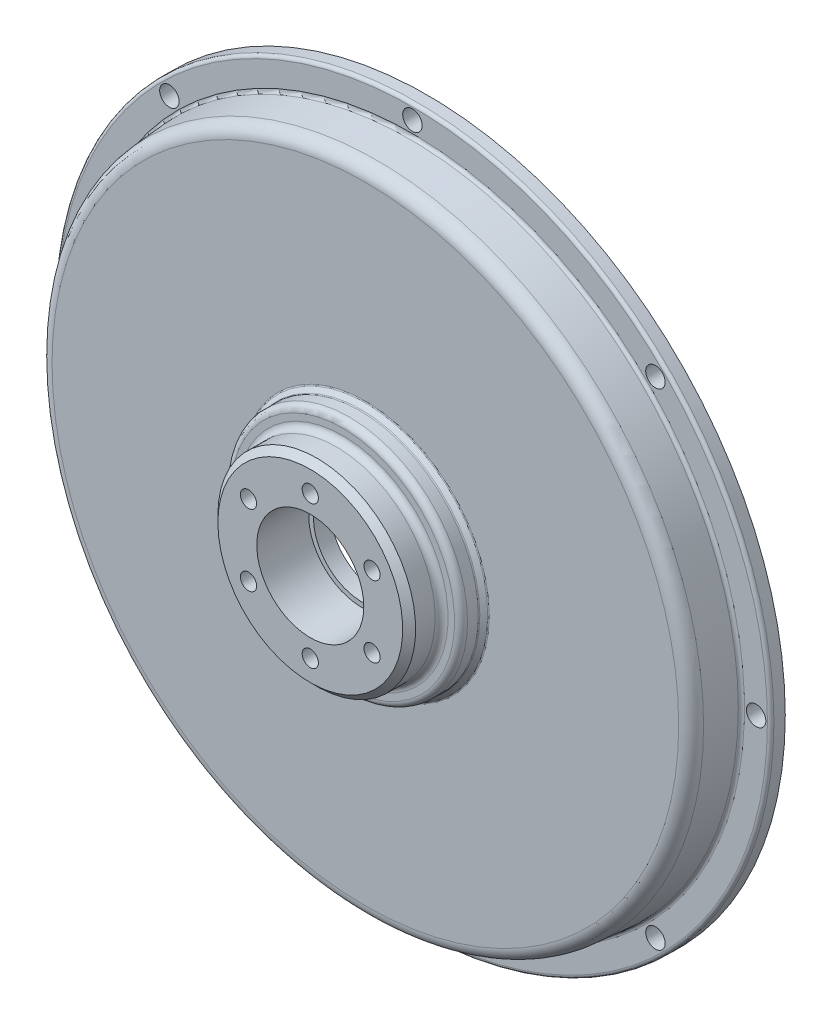
ISO-10303-21;
HEADER;
FILE_DESCRIPTION(('STEP AP214'),'2;1');
FILE_NAME('part.step','',(''),(''),'','','');
FILE_SCHEMA(('AUTOMOTIVE_DESIGN { 1 0 10303 214 1 1 1 1 }'));
ENDSEC;
DATA;
#1=APPLICATION_CONTEXT('core data for automotive mechanical design processes');
#2=APPLICATION_PROTOCOL_DEFINITION('international standard','automotive_design',2000,#1);
#3=PRODUCT_CONTEXT('',#1,'mechanical');
#4=PRODUCT('Part','Part','',(#3));
#5=PRODUCT_RELATED_PRODUCT_CATEGORY('part','',(#4));
#6=PRODUCT_DEFINITION_FORMATION('','',#4);
#7=PRODUCT_DEFINITION_CONTEXT('part definition',#1,'design');
#8=PRODUCT_DEFINITION('design','',#6,#7);
#9=PRODUCT_DEFINITION_SHAPE('','',#8);
#10=(LENGTH_UNIT() NAMED_UNIT(*) SI_UNIT(.MILLI.,.METRE.));
#11=(NAMED_UNIT(*) PLANE_ANGLE_UNIT() SI_UNIT($,.RADIAN.));
#12=(NAMED_UNIT(*) SI_UNIT($,.STERADIAN.) SOLID_ANGLE_UNIT());
#13=UNCERTAINTY_MEASURE_WITH_UNIT(LENGTH_MEASURE(1.E-05),#10,'distance_accuracy_value','');
#14=(GEOMETRIC_REPRESENTATION_CONTEXT(3) GLOBAL_UNCERTAINTY_ASSIGNED_CONTEXT((#13)) GLOBAL_UNIT_ASSIGNED_CONTEXT((#10,
#11,#12)) REPRESENTATION_CONTEXT('',''));
#15=CARTESIAN_POINT('',(0.,0.,0.));
#16=DIRECTION('',(0.,0.,1.));
#17=DIRECTION('',(1.,0.,0.));
#18=AXIS2_PLACEMENT_3D('',#15,#16,#17);
#19=CARTESIAN_POINT('',(-28.5,0.,36.));
#20=DIRECTION('',(0.,0.,1.));
#21=DIRECTION('',(1.,0.,0.));
#22=AXIS2_PLACEMENT_3D('',#19,#20,#21);
#23=PLANE('',#22);
#24=CARTESIAN_POINT('',(0.,22.,36.));
#25=DIRECTION('',(0.,0.,1.));
#26=DIRECTION('',(1.,0.,0.));
#27=AXIS2_PLACEMENT_3D('',#24,#25,#26);
#28=CIRCLE('',#27,2.5);
#29=CARTESIAN_POINT('',(2.5,22.,36.));
#30=VERTEX_POINT('',#29);
#31=EDGE_CURVE('E323',#30,#30,#28,.T.);
#32=ORIENTED_EDGE('',*,*,#31,.F.);
#33=EDGE_LOOP('',(#32));
#34=FACE_BOUND('',#33,.T.);
#35=CARTESIAN_POINT('',(-19.0525588832573,10.9999999999995,36.));
#36=DIRECTION('',(0.,0.,1.));
#37=DIRECTION('',(1.,0.,0.));
#38=AXIS2_PLACEMENT_3D('',#35,#36,#37);
#39=CIRCLE('',#38,2.50000000000071);
#40=CARTESIAN_POINT('',(-16.5525588832566,10.9999999999995,36.));
#41=VERTEX_POINT('',#40);
#42=EDGE_CURVE('E316',#41,#41,#39,.T.);
#43=ORIENTED_EDGE('',*,*,#42,.F.);
#44=EDGE_LOOP('',(#43));
#45=FACE_BOUND('',#44,.T.);
#46=CARTESIAN_POINT('',(-19.0525588832567,-11.0000000000005,36.));
#47=DIRECTION('',(0.,0.,1.));
#48=DIRECTION('',(1.,0.,0.));
#49=AXIS2_PLACEMENT_3D('',#46,#47,#48);
#50=CIRCLE('',#49,2.50000000000123);
#51=CARTESIAN_POINT('',(-16.5525588832555,-11.0000000000005,36.));
#52=VERTEX_POINT('',#51);
#53=EDGE_CURVE('E330',#52,#52,#50,.T.);
#54=ORIENTED_EDGE('',*,*,#53,.F.);
#55=EDGE_LOOP('',(#54));
#56=FACE_BOUND('',#55,.T.);
#57=CARTESIAN_POINT('',(1.23822787511762E-12,-22.,36.));
#58=DIRECTION('',(0.,0.,1.));
#59=DIRECTION('',(1.,0.,0.));
#60=AXIS2_PLACEMENT_3D('',#57,#58,#59);
#61=CIRCLE('',#60,2.50000000000132);
#62=CARTESIAN_POINT('',(2.50000000000256,-22.,36.));
#63=VERTEX_POINT('',#62);
#64=EDGE_CURVE('E347',#63,#63,#61,.T.);
#65=ORIENTED_EDGE('',*,*,#64,.F.);
#66=EDGE_LOOP('',(#65));
#67=FACE_BOUND('',#66,.T.);
#68=CARTESIAN_POINT('',(19.0525588832586,-10.9999999999995,36.));
#69=DIRECTION('',(0.,0.,1.));
#70=DIRECTION('',(1.,0.,0.));
#71=AXIS2_PLACEMENT_3D('',#68,#69,#70);
#72=CIRCLE('',#71,2.50000000000082);
#73=CARTESIAN_POINT('',(21.5525588832594,-10.9999999999995,36.));
#74=VERTEX_POINT('',#73);
#75=EDGE_CURVE('E341',#74,#74,#72,.T.);
#76=ORIENTED_EDGE('',*,*,#75,.F.);
#77=EDGE_LOOP('',(#76));
#78=FACE_BOUND('',#77,.T.);
#79=CARTESIAN_POINT('',(19.052558883258,11.0000000000005,36.));
#80=DIRECTION('',(0.,0.,1.));
#81=DIRECTION('',(1.,0.,0.));
#82=AXIS2_PLACEMENT_3D('',#79,#80,#81);
#83=CIRCLE('',#82,2.50000000000019);
#84=CARTESIAN_POINT('',(21.5525588832581,11.0000000000005,36.));
#85=VERTEX_POINT('',#84);
#86=EDGE_CURVE('E335',#85,#85,#83,.T.);
#87=ORIENTED_EDGE('',*,*,#86,.F.);
#88=EDGE_LOOP('',(#87));
#89=FACE_BOUND('',#88,.T.);
#90=CARTESIAN_POINT('',(0.,0.,36.));
#91=DIRECTION('',(0.,0.,1.));
#92=DIRECTION('',(1.,0.,0.));
#93=AXIS2_PLACEMENT_3D('',#90,#91,#92);
#94=CIRCLE('',#93,16.5);
#95=CARTESIAN_POINT('',(16.5,0.,36.));
#96=VERTEX_POINT('',#95);
#97=EDGE_CURVE('E322',#96,#96,#94,.T.);
#98=ORIENTED_EDGE('',*,*,#97,.F.);
#99=EDGE_LOOP('',(#98));
#100=FACE_BOUND('',#99,.T.);
#101=CARTESIAN_POINT('',(0.,0.,36.));
#102=DIRECTION('',(0.,0.,-1.));
#103=DIRECTION('',(-1.,0.,0.));
#104=AXIS2_PLACEMENT_3D('',#101,#102,#103);
#105=CIRCLE('',#104,28.5);
#106=CARTESIAN_POINT('',(-28.5,0.,36.));
#107=VERTEX_POINT('',#106);
#108=EDGE_CURVE('E121',#107,#107,#105,.T.);
#109=ORIENTED_EDGE('',*,*,#108,.F.);
#110=EDGE_LOOP('',(#109));
#111=FACE_BOUND('',#110,.T.);
#112=ADVANCED_FACE('F37',(#34,#45,#56,#67,#78,#89,#100,#111),#23,.T.);
#113=CARTESIAN_POINT('',(0.,0.,34.));
#114=DIRECTION('',(0.,0.,-1.));
#115=DIRECTION('',(-1.,0.,0.));
#116=AXIS2_PLACEMENT_3D('',#113,#114,#115);
#117=CONICAL_SURFACE('',#116,30.5,0.785398163397447);
#118=ORIENTED_EDGE('',*,*,#108,.T.);
#119=EDGE_LOOP('',(#118));
#120=FACE_BOUND('',#119,.T.);
#121=CARTESIAN_POINT('',(0.,0.,34.));
#122=DIRECTION('',(0.,0.,-1.));
#123=DIRECTION('',(-1.,0.,0.));
#124=AXIS2_PLACEMENT_3D('',#121,#122,#123);
#125=CIRCLE('',#124,30.5);
#126=CARTESIAN_POINT('',(-30.5,0.,34.));
#127=VERTEX_POINT('',#126);
#128=EDGE_CURVE('E118',#127,#127,#125,.T.);
#129=ORIENTED_EDGE('',*,*,#128,.F.);
#130=EDGE_LOOP('',(#129));
#131=FACE_BOUND('',#130,.T.);
#132=ADVANCED_FACE('F145',(#120,#131),#117,.T.);
#133=CARTESIAN_POINT('',(0.,0.,0.));
#134=DIRECTION('',(0.,0.,-1.));
#135=DIRECTION('',(-1.,0.,0.));
#136=AXIS2_PLACEMENT_3D('',#133,#134,#135);
#137=CYLINDRICAL_SURFACE('',#136,30.5);
#138=ORIENTED_EDGE('',*,*,#128,.T.);
#139=EDGE_LOOP('',(#138));
#140=FACE_BOUND('',#139,.T.);
#141=CARTESIAN_POINT('',(0.,0.,28.));
#142=DIRECTION('',(0.,0.,-1.));
#143=DIRECTION('',(-1.,0.,0.));
#144=AXIS2_PLACEMENT_3D('',#141,#142,#143);
#145=CIRCLE('',#144,30.5);
#146=CARTESIAN_POINT('',(-30.5,0.,28.));
#147=VERTEX_POINT('',#146);
#148=EDGE_CURVE('E115',#147,#147,#145,.T.);
#149=ORIENTED_EDGE('',*,*,#148,.F.);
#150=EDGE_LOOP('',(#149));
#151=FACE_BOUND('',#150,.T.);
#152=ADVANCED_FACE('F151',(#140,#151),#137,.T.);
#153=CARTESIAN_POINT('',(0.,0.,28.));
#154=DIRECTION('',(0.,0.,-1.));
#155=DIRECTION('',(-1.,0.,0.));
#156=AXIS2_PLACEMENT_3D('',#153,#154,#155);
#157=TOROIDAL_SURFACE('',#156,32.5,2.);
#158=ORIENTED_EDGE('',*,*,#148,.T.);
#159=EDGE_LOOP('',(#158));
#160=FACE_BOUND('',#159,.T.);
#161=CARTESIAN_POINT('',(0.,0.,26.));
#162=DIRECTION('',(0.,0.,-1.));
#163=DIRECTION('',(-1.,0.,0.));
#164=AXIS2_PLACEMENT_3D('',#161,#162,#163);
#165=CIRCLE('',#164,32.5);
#166=CARTESIAN_POINT('',(-32.5,0.,26.));
#167=VERTEX_POINT('',#166);
#168=EDGE_CURVE('E112',#167,#167,#165,.T.);
#169=ORIENTED_EDGE('',*,*,#168,.F.);
#170=EDGE_LOOP('',(#169));
#171=FACE_BOUND('',#170,.T.);
#172=ADVANCED_FACE('F159',(#160,#171),#157,.F.);
#173=CARTESIAN_POINT('',(-34.5,0.,26.));
#174=DIRECTION('',(0.,0.,1.));
#175=DIRECTION('',(1.,0.,0.));
#176=AXIS2_PLACEMENT_3D('',#173,#174,#175);
#177=PLANE('',#176);
#178=ORIENTED_EDGE('',*,*,#168,.T.);
#179=EDGE_LOOP('',(#178));
#180=FACE_BOUND('',#179,.T.);
#181=CARTESIAN_POINT('',(0.,0.,26.));
#182=DIRECTION('',(0.,0.,-1.));
#183=DIRECTION('',(-1.,0.,0.));
#184=AXIS2_PLACEMENT_3D('',#181,#182,#183);
#185=CIRCLE('',#184,34.5);
#186=CARTESIAN_POINT('',(-34.5,0.,26.));
#187=VERTEX_POINT('',#186);
#188=EDGE_CURVE('E109',#187,#187,#185,.T.);
#189=ORIENTED_EDGE('',*,*,#188,.F.);
#190=EDGE_LOOP('',(#189));
#191=FACE_BOUND('',#190,.T.);
#192=ADVANCED_FACE('F163',(#180,#191),#177,.T.);
#193=CARTESIAN_POINT('',(0.,0.,24.));
#194=DIRECTION('',(0.,0.,-1.));
#195=DIRECTION('',(-1.,0.,0.));
#196=AXIS2_PLACEMENT_3D('',#193,#194,#195);
#197=TOROIDAL_SURFACE('',#196,34.5,2.);
#198=ORIENTED_EDGE('',*,*,#188,.T.);
#199=EDGE_LOOP('',(#198));
#200=FACE_BOUND('',#199,.T.);
#201=CARTESIAN_POINT('',(0.,0.,24.));
#202=DIRECTION('',(0.,0.,-1.));
#203=DIRECTION('',(-1.,0.,0.));
#204=AXIS2_PLACEMENT_3D('',#201,#202,#203);
#205=CIRCLE('',#204,36.5);
#206=CARTESIAN_POINT('',(-36.5,0.,24.));
#207=VERTEX_POINT('',#206);
#208=EDGE_CURVE('E106',#207,#207,#205,.T.);
#209=ORIENTED_EDGE('',*,*,#208,.F.);
#210=EDGE_LOOP('',(#209));
#211=FACE_BOUND('',#210,.T.);
#212=ADVANCED_FACE('F167',(#200,#211),#197,.T.);
#213=CARTESIAN_POINT('',(0.,0.,0.));
#214=DIRECTION('',(0.,0.,-1.));
#215=DIRECTION('',(-1.,0.,0.));
#216=AXIS2_PLACEMENT_3D('',#213,#214,#215);
#217=CYLINDRICAL_SURFACE('',#216,36.5);
#218=CARTESIAN_POINT('',(0.,0.,20.7071067811866));
#219=DIRECTION('',(0.,0.,-1.));
#220=DIRECTION('',(-1.,0.,0.));
#221=AXIS2_PLACEMENT_3D('',#218,#219,#220);
#222=CIRCLE('',#221,36.5);
#223=CARTESIAN_POINT('',(-36.5,0.,20.7071067811866));
#224=VERTEX_POINT('',#223);
#225=EDGE_CURVE('E10',#224,#224,#222,.F.);
#226=ORIENTED_EDGE('',*,*,#225,.T.);
#227=EDGE_LOOP('',(#226));
#228=FACE_BOUND('',#227,.T.);
#229=ORIENTED_EDGE('',*,*,#208,.T.);
#230=EDGE_LOOP('',(#229));
#231=FACE_BOUND('',#230,.T.);
#232=ADVANCED_FACE('F171',(#228,#231),#217,.T.);
#233=CARTESIAN_POINT('',(0.,0.,19.));
#234=DIRECTION('',(0.,0.,-1.));
#235=DIRECTION('',(-1.,0.,0.));
#236=AXIS2_PLACEMENT_3D('',#233,#234,#235);
#237=CONICAL_SURFACE('',#236,38.,0.785398163397448);
#238=CARTESIAN_POINT('',(0.,0.,19.1464466094067));
#239=DIRECTION('',(0.,0.,-1.));
#240=DIRECTION('',(-1.,0.,0.));
#241=AXIS2_PLACEMENT_3D('',#238,#239,#240);
#242=CIRCLE('',#241,37.8535533905933);
#243=CARTESIAN_POINT('',(-37.8535533905933,0.,19.1464466094067));
#244=VERTEX_POINT('',#243);
#245=EDGE_CURVE('E45',#244,#244,#242,.F.);
#246=ORIENTED_EDGE('',*,*,#245,.T.);
#247=EDGE_LOOP('',(#246));
#248=FACE_BOUND('',#247,.T.);
#249=CARTESIAN_POINT('',(0.,0.,20.3535533905933));
#250=DIRECTION('',(0.,0.,-1.));
#251=DIRECTION('',(-1.,0.,0.));
#252=AXIS2_PLACEMENT_3D('',#249,#250,#251);
#253=CIRCLE('',#252,36.6464466094067);
#254=CARTESIAN_POINT('',(-36.6464466094067,0.,20.3535533905933));
#255=VERTEX_POINT('',#254);
#256=EDGE_CURVE('E50',#255,#255,#253,.T.);
#257=ORIENTED_EDGE('',*,*,#256,.T.);
#258=EDGE_LOOP('',(#257));
#259=FACE_BOUND('',#258,.T.);
#260=ADVANCED_FACE('F129',(#248,#259),#237,.T.);
#261=CARTESIAN_POINT('',(-96.6379312609729,0.,19.));
#262=DIRECTION('',(0.,0.,1.));
#263=DIRECTION('',(1.,0.,0.));
#264=AXIS2_PLACEMENT_3D('',#261,#262,#263);
#265=PLANE('',#264);
#266=CARTESIAN_POINT('',(0.,0.,19.));
#267=DIRECTION('',(0.,0.,1.));
#268=DIRECTION('',(1.,0.,0.));
#269=AXIS2_PLACEMENT_3D('',#266,#267,#268);
#270=CIRCLE('',#269,38.2071067811866);
#271=CARTESIAN_POINT('',(38.2071067811866,0.,19.));
#272=VERTEX_POINT('',#271);
#273=EDGE_CURVE('E124',#272,#272,#270,.F.);
#274=ORIENTED_EDGE('',*,*,#273,.T.);
#275=EDGE_LOOP('',(#274));
#276=FACE_BOUND('',#275,.T.);
#277=CARTESIAN_POINT('',(0.,0.,19.));
#278=DIRECTION('',(0.,0.,-1.));
#279=DIRECTION('',(-1.,0.,0.));
#280=AXIS2_PLACEMENT_3D('',#277,#278,#279);
#281=CIRCLE('',#280,96.6379312609729);
#282=CARTESIAN_POINT('',(-96.6379312609729,0.,19.));
#283=VERTEX_POINT('',#282);
#284=EDGE_CURVE('E103',#283,#283,#281,.T.);
#285=ORIENTED_EDGE('',*,*,#284,.F.);
#286=EDGE_LOOP('',(#285));
#287=FACE_BOUND('',#286,.T.);
#288=ADVANCED_FACE('F177',(#276,#287),#265,.T.);
#289=CARTESIAN_POINT('',(0.,0.,15.));
#290=DIRECTION('',(0.,0.,-1.));
#291=DIRECTION('',(-1.,0.,0.));
#292=AXIS2_PLACEMENT_3D('',#289,#290,#291);
#293=TOROIDAL_SURFACE('',#292,96.6379312609729,4.);
#294=ORIENTED_EDGE('',*,*,#284,.T.);
#295=EDGE_LOOP('',(#294));
#296=FACE_BOUND('',#295,.T.);
#297=CARTESIAN_POINT('',(0.,0.,15.3223816882688));
#298=DIRECTION('',(0.,0.,-1.));
#299=DIRECTION('',(-1.,0.,0.));
#300=AXIS2_PLACEMENT_3D('',#297,#298,#299);
#301=CIRCLE('',#300,100.624918851507);
#302=CARTESIAN_POINT('',(-100.624918851507,0.,15.3223816882688));
#303=VERTEX_POINT('',#302);
#304=EDGE_CURVE('E100',#303,#303,#301,.T.);
#305=ORIENTED_EDGE('',*,*,#304,.F.);
#306=EDGE_LOOP('',(#305));
#307=FACE_BOUND('',#306,.T.);
#308=ADVANCED_FACE('F181',(#296,#307),#293,.T.);
#309=CARTESIAN_POINT('',(0.,0.,5.4194045779328));
#310=DIRECTION('',(0.,0.,-1.));
#311=DIRECTION('',(-1.,0.,0.));
#312=AXIS2_PLACEMENT_3D('',#309,#310,#311);
#313=CONICAL_SURFACE('',#312,101.425658359023,0.0806829310007517);
#314=ORIENTED_EDGE('',*,*,#304,.T.);
#315=EDGE_LOOP('',(#314));
#316=FACE_BOUND('',#315,.T.);
#317=CARTESIAN_POINT('',(0.,0.,5.4194045779328));
#318=DIRECTION('',(0.,0.,-1.));
#319=DIRECTION('',(-1.,0.,0.));
#320=AXIS2_PLACEMENT_3D('',#317,#318,#319);
#321=CIRCLE('',#320,101.425658359023);
#322=CARTESIAN_POINT('',(-101.425658359023,0.,5.41940457793282));
#323=VERTEX_POINT('',#322);
#324=EDGE_CURVE('E97',#323,#323,#321,.T.);
#325=ORIENTED_EDGE('',*,*,#324,.F.);
#326=EDGE_LOOP('',(#325));
#327=FACE_BOUND('',#326,.T.);
#328=ADVANCED_FACE('F185',(#316,#327),#313,.T.);
#329=CARTESIAN_POINT('',(0.,0.,5.49999999999999));
#330=DIRECTION('',(0.,0.,-1.));
#331=DIRECTION('',(-1.,0.,0.));
#332=AXIS2_PLACEMENT_3D('',#329,#330,#331);
#333=TOROIDAL_SURFACE('',#332,102.422405256656,1.);
#334=ORIENTED_EDGE('',*,*,#324,.T.);
#335=EDGE_LOOP('',(#334));
#336=FACE_BOUND('',#335,.T.);
#337=CARTESIAN_POINT('',(0.,0.,4.49999999999999));
#338=DIRECTION('',(0.,0.,-1.));
#339=DIRECTION('',(-1.,0.,0.));
#340=AXIS2_PLACEMENT_3D('',#337,#338,#339);
#341=CIRCLE('',#340,102.422405256656);
#342=CARTESIAN_POINT('',(-102.422405256656,0.,4.50000000000001));
#343=VERTEX_POINT('',#342);
#344=EDGE_CURVE('E94',#343,#343,#341,.T.);
#345=ORIENTED_EDGE('',*,*,#344,.F.);
#346=EDGE_LOOP('',(#345));
#347=FACE_BOUND('',#346,.T.);
#348=ADVANCED_FACE('F189',(#336,#347),#333,.F.);
#349=CARTESIAN_POINT('',(-109.5,0.,4.50000000000002));
#350=DIRECTION('',(0.,0.,1.));
#351=DIRECTION('',(1.,0.,0.));
#352=AXIS2_PLACEMENT_3D('',#349,#350,#351);
#353=PLANE('',#352);
#354=CARTESIAN_POINT('',(0.,106.,4.49999999999999));
#355=DIRECTION('',(0.,0.,1.));
#356=DIRECTION('',(1.,0.,0.));
#357=AXIS2_PLACEMENT_3D('',#354,#355,#356);
#358=CIRCLE('',#357,3.);
#359=CARTESIAN_POINT('',(3.,106.,4.49999999999999));
#360=VERTEX_POINT('',#359);
#361=EDGE_CURVE('E58',#360,#360,#358,.T.);
#362=ORIENTED_EDGE('',*,*,#361,.F.);
#363=EDGE_LOOP('',(#362));
#364=FACE_BOUND('',#363,.T.);
#365=CARTESIAN_POINT('',(74.9533188057742,74.9533188057739,4.49999999999999));
#366=DIRECTION('',(0.,0.,1.));
#367=DIRECTION('',(1.,0.,0.));
#368=AXIS2_PLACEMENT_3D('',#365,#366,#367);
#369=CIRCLE('',#368,2.99999999999999);
#370=CARTESIAN_POINT('',(77.9533188057742,74.9533188057739,4.49999999999999));
#371=VERTEX_POINT('',#370);
#372=EDGE_CURVE('E362',#371,#371,#369,.T.);
#373=ORIENTED_EDGE('',*,*,#372,.F.);
#374=EDGE_LOOP('',(#373));
#375=FACE_BOUND('',#374,.T.);
#376=CARTESIAN_POINT('',(106.,-3.70097021917372E-13,4.49999999999999));
#377=DIRECTION('',(0.,0.,1.));
#378=DIRECTION('',(1.,0.,0.));
#379=AXIS2_PLACEMENT_3D('',#376,#377,#378);
#380=CIRCLE('',#379,3.);
#381=CARTESIAN_POINT('',(109.,-3.70097021917372E-13,4.49999999999999));
#382=VERTEX_POINT('',#381);
#383=EDGE_CURVE('E365',#382,#382,#380,.T.);
#384=ORIENTED_EDGE('',*,*,#383,.F.);
#385=EDGE_LOOP('',(#384));
#386=FACE_BOUND('',#385,.T.);
#387=CARTESIAN_POINT('',(74.9533188057766,-74.953318805773,4.49999999999999));
#388=DIRECTION('',(0.,0.,1.));
#389=DIRECTION('',(1.,0.,0.));
#390=AXIS2_PLACEMENT_3D('',#387,#388,#389);
#391=CIRCLE('',#390,3.00000000000265);
#392=CARTESIAN_POINT('',(77.9533188057792,-74.953318805773,4.49999999999999));
#393=VERTEX_POINT('',#392);
#394=EDGE_CURVE('E368',#393,#393,#391,.T.);
#395=ORIENTED_EDGE('',*,*,#394,.F.);
#396=EDGE_LOOP('',(#395));
#397=FACE_BOUND('',#396,.T.);
#398=CARTESIAN_POINT('',(2.98760604921889E-12,-106.,4.49999999999999));
#399=DIRECTION('',(0.,0.,1.));
#400=DIRECTION('',(1.,0.,0.));
#401=AXIS2_PLACEMENT_3D('',#398,#399,#400);
#402=CIRCLE('',#401,3.00000000000357);
#403=CARTESIAN_POINT('',(3.00000000000656,-106.,4.49999999999999));
#404=VERTEX_POINT('',#403);
#405=EDGE_CURVE('E371',#404,#404,#402,.T.);
#406=ORIENTED_EDGE('',*,*,#405,.F.);
#407=EDGE_LOOP('',(#406));
#408=FACE_BOUND('',#407,.T.);
#409=CARTESIAN_POINT('',(-74.9533188057715,-74.9533188057751,4.49999999999999));
#410=DIRECTION('',(0.,0.,1.));
#411=DIRECTION('',(1.,0.,0.));
#412=AXIS2_PLACEMENT_3D('',#409,#410,#411);
#413=CIRCLE('',#412,3.00000000000366);
#414=CARTESIAN_POINT('',(-71.9533188057679,-74.9533188057751,4.49999999999999));
#415=VERTEX_POINT('',#414);
#416=EDGE_CURVE('E374',#415,#415,#413,.T.);
#417=ORIENTED_EDGE('',*,*,#416,.F.);
#418=EDGE_LOOP('',(#417));
#419=FACE_BOUND('',#418,.T.);
#420=CARTESIAN_POINT('',(-105.999999999999,-1.50635059981141E-12,4.49999999999999));
#421=DIRECTION('',(0.,0.,1.));
#422=DIRECTION('',(1.,0.,0.));
#423=AXIS2_PLACEMENT_3D('',#420,#421,#422);
#424=CIRCLE('',#423,3.00000000000294);
#425=CARTESIAN_POINT('',(-102.999999999996,-1.50635059981141E-12,4.49999999999999));
#426=VERTEX_POINT('',#425);
#427=EDGE_CURVE('E376',#426,#426,#424,.T.);
#428=ORIENTED_EDGE('',*,*,#427,.F.);
#429=EDGE_LOOP('',(#428));
#430=FACE_BOUND('',#429,.T.);
#431=CARTESIAN_POINT('',(-74.9533188057731,74.953318805775,4.49999999999999));
#432=DIRECTION('',(0.,0.,1.));
#433=DIRECTION('',(1.,0.,0.));
#434=AXIS2_PLACEMENT_3D('',#431,#432,#433);
#435=CIRCLE('',#434,3.);
#436=CARTESIAN_POINT('',(-71.9533188057731,74.953318805775,4.49999999999999));
#437=VERTEX_POINT('',#436);
#438=EDGE_CURVE('E89',#437,#437,#435,.T.);
#439=ORIENTED_EDGE('',*,*,#438,.F.);
#440=EDGE_LOOP('',(#439));
#441=FACE_BOUND('',#440,.T.);
#442=ORIENTED_EDGE('',*,*,#344,.T.);
#443=EDGE_LOOP('',(#442));
#444=FACE_BOUND('',#443,.T.);
#445=CARTESIAN_POINT('',(0.,0.,4.49999999999999));
#446=DIRECTION('',(0.,0.,-1.));
#447=DIRECTION('',(-1.,0.,0.));
#448=AXIS2_PLACEMENT_3D('',#445,#446,#447);
#449=CIRCLE('',#448,109.5);
#450=CARTESIAN_POINT('',(-109.5,0.,4.50000000000001));
#451=VERTEX_POINT('',#450);
#452=EDGE_CURVE('E86',#451,#451,#449,.T.);
#453=ORIENTED_EDGE('',*,*,#452,.F.);
#454=EDGE_LOOP('',(#453));
#455=FACE_BOUND('',#454,.T.);
#456=ADVANCED_FACE('F193',(#364,#375,#386,#397,#408,#419,#430,#441,#444,#455),#353,.T.);
#457=CARTESIAN_POINT('',(0.,0.,3.49999999999999));
#458=DIRECTION('',(0.,0.,-1.));
#459=DIRECTION('',(-1.,0.,0.));
#460=AXIS2_PLACEMENT_3D('',#457,#458,#459);
#461=TOROIDAL_SURFACE('',#460,109.5,1.);
#462=ORIENTED_EDGE('',*,*,#452,.T.);
#463=EDGE_LOOP('',(#462));
#464=FACE_BOUND('',#463,.T.);
#465=CARTESIAN_POINT('',(0.,0.,3.49999999999999));
#466=DIRECTION('',(0.,0.,-1.));
#467=DIRECTION('',(-1.,0.,0.));
#468=AXIS2_PLACEMENT_3D('',#465,#466,#467);
#469=CIRCLE('',#468,110.5);
#470=CARTESIAN_POINT('',(-110.5,0.,3.50000000000001));
#471=VERTEX_POINT('',#470);
#472=EDGE_CURVE('E81',#471,#471,#469,.T.);
#473=ORIENTED_EDGE('',*,*,#472,.F.);
#474=EDGE_LOOP('',(#473));
#475=FACE_BOUND('',#474,.T.);
#476=ADVANCED_FACE('F197',(#464,#475),#461,.T.);
#477=CARTESIAN_POINT('',(0.,0.,0.));
#478=DIRECTION('',(0.,0.,-1.));
#479=DIRECTION('',(-1.,0.,0.));
#480=AXIS2_PLACEMENT_3D('',#477,#478,#479);
#481=CYLINDRICAL_SURFACE('',#480,110.5);
#482=ORIENTED_EDGE('',*,*,#472,.T.);
#483=EDGE_LOOP('',(#482));
#484=FACE_BOUND('',#483,.T.);
#485=CARTESIAN_POINT('',(0.,0.,0.));
#486=DIRECTION('',(0.,0.,-1.));
#487=DIRECTION('',(-1.,0.,0.));
#488=AXIS2_PLACEMENT_3D('',#485,#486,#487);
#489=CIRCLE('',#488,110.5);
#490=CARTESIAN_POINT('',(-110.5,0.,0.));
#491=VERTEX_POINT('',#490);
#492=EDGE_CURVE('E77',#491,#491,#489,.T.);
#493=ORIENTED_EDGE('',*,*,#492,.F.);
#494=EDGE_LOOP('',(#493));
#495=FACE_BOUND('',#494,.T.);
#496=ADVANCED_FACE('F201',(#484,#495),#481,.T.);
#497=CARTESIAN_POINT('',(-110.5,0.,0.));
#498=DIRECTION('',(0.,0.,-1.));
#499=DIRECTION('',(-1.,0.,0.));
#500=AXIS2_PLACEMENT_3D('',#497,#498,#499);
#501=PLANE('',#500);
#502=CARTESIAN_POINT('',(0.,0.,0.));
#503=DIRECTION('',(0.,0.,-1.));
#504=DIRECTION('',(-1.,0.,0.));
#505=AXIS2_PLACEMENT_3D('',#502,#503,#504);
#506=CIRCLE('',#505,95.);
#507=CARTESIAN_POINT('',(-95.,0.,0.));
#508=VERTEX_POINT('',#507);
#509=EDGE_CURVE('E311',#508,#508,#506,.T.);
#510=ORIENTED_EDGE('',*,*,#509,.F.);
#511=EDGE_LOOP('',(#510));
#512=FACE_BOUND('',#511,.T.);
#513=CARTESIAN_POINT('',(0.,106.,0.));
#514=DIRECTION('',(0.,0.,-1.));
#515=DIRECTION('',(-1.,0.,0.));
#516=AXIS2_PLACEMENT_3D('',#513,#514,#515);
#517=CIRCLE('',#516,3.);
#518=CARTESIAN_POINT('',(-3.,106.,0.));
#519=VERTEX_POINT('',#518);
#520=EDGE_CURVE('E75',#519,#519,#517,.T.);
#521=ORIENTED_EDGE('',*,*,#520,.F.);
#522=EDGE_LOOP('',(#521));
#523=FACE_BOUND('',#522,.T.);
#524=CARTESIAN_POINT('',(74.9533188057742,74.9533188057739,0.));
#525=DIRECTION('',(0.,0.,-1.));
#526=DIRECTION('',(-1.,0.,0.));
#527=AXIS2_PLACEMENT_3D('',#524,#525,#526);
#528=CIRCLE('',#527,2.99999999999999);
#529=CARTESIAN_POINT('',(71.9533188057742,74.9533188057739,0.));
#530=VERTEX_POINT('',#529);
#531=EDGE_CURVE('E73',#530,#530,#528,.T.);
#532=ORIENTED_EDGE('',*,*,#531,.F.);
#533=EDGE_LOOP('',(#532));
#534=FACE_BOUND('',#533,.T.);
#535=CARTESIAN_POINT('',(106.,-3.70097021917372E-13,0.));
#536=DIRECTION('',(0.,0.,-1.));
#537=DIRECTION('',(-1.,0.,0.));
#538=AXIS2_PLACEMENT_3D('',#535,#536,#537);
#539=CIRCLE('',#538,3.);
#540=CARTESIAN_POINT('',(103.,-3.70097021917372E-13,0.));
#541=VERTEX_POINT('',#540);
#542=EDGE_CURVE('E70',#541,#541,#539,.T.);
#543=ORIENTED_EDGE('',*,*,#542,.F.);
#544=EDGE_LOOP('',(#543));
#545=FACE_BOUND('',#544,.T.);
#546=CARTESIAN_POINT('',(74.9533188057766,-74.953318805773,0.));
#547=DIRECTION('',(0.,0.,-1.));
#548=DIRECTION('',(-1.,0.,0.));
#549=AXIS2_PLACEMENT_3D('',#546,#547,#548);
#550=CIRCLE('',#549,3.00000000000265);
#551=CARTESIAN_POINT('',(71.9533188057739,-74.953318805773,0.));
#552=VERTEX_POINT('',#551);
#553=EDGE_CURVE('E67',#552,#552,#550,.T.);
#554=ORIENTED_EDGE('',*,*,#553,.F.);
#555=EDGE_LOOP('',(#554));
#556=FACE_BOUND('',#555,.T.);
#557=CARTESIAN_POINT('',(2.98760604921889E-12,-106.,0.));
#558=DIRECTION('',(0.,0.,-1.));
#559=DIRECTION('',(-1.,0.,0.));
#560=AXIS2_PLACEMENT_3D('',#557,#558,#559);
#561=CIRCLE('',#560,3.00000000000357);
#562=CARTESIAN_POINT('',(-3.00000000000058,-106.,0.));
#563=VERTEX_POINT('',#562);
#564=EDGE_CURVE('E64',#563,#563,#561,.T.);
#565=ORIENTED_EDGE('',*,*,#564,.F.);
#566=EDGE_LOOP('',(#565));
#567=FACE_BOUND('',#566,.T.);
#568=CARTESIAN_POINT('',(-74.9533188057715,-74.9533188057751,0.));
#569=DIRECTION('',(0.,0.,-1.));
#570=DIRECTION('',(-1.,0.,0.));
#571=AXIS2_PLACEMENT_3D('',#568,#569,#570);
#572=CIRCLE('',#571,3.00000000000366);
#573=CARTESIAN_POINT('',(-77.9533188057752,-74.9533188057751,0.));
#574=VERTEX_POINT('',#573);
#575=EDGE_CURVE('E61',#574,#574,#572,.T.);
#576=ORIENTED_EDGE('',*,*,#575,.F.);
#577=EDGE_LOOP('',(#576));
#578=FACE_BOUND('',#577,.T.);
#579=CARTESIAN_POINT('',(-105.999999999999,-1.50635059981141E-12,0.));
#580=DIRECTION('',(0.,0.,-1.));
#581=DIRECTION('',(-1.,0.,0.));
#582=AXIS2_PLACEMENT_3D('',#579,#580,#581);
#583=CIRCLE('',#582,3.00000000000294);
#584=CARTESIAN_POINT('',(-109.000000000001,-1.50635059981141E-12,0.));
#585=VERTEX_POINT('',#584);
#586=EDGE_CURVE('E57',#585,#585,#583,.T.);
#587=ORIENTED_EDGE('',*,*,#586,.F.);
#588=EDGE_LOOP('',(#587));
#589=FACE_BOUND('',#588,.T.);
#590=CARTESIAN_POINT('',(-74.9533188057731,74.953318805775,0.));
#591=DIRECTION('',(0.,0.,-1.));
#592=DIRECTION('',(-1.,0.,0.));
#593=AXIS2_PLACEMENT_3D('',#590,#591,#592);
#594=CIRCLE('',#593,3.);
#595=CARTESIAN_POINT('',(-77.9533188057731,74.953318805775,0.));
#596=VERTEX_POINT('',#595);
#597=EDGE_CURVE('E54',#596,#596,#594,.T.);
#598=ORIENTED_EDGE('',*,*,#597,.F.);
#599=EDGE_LOOP('',(#598));
#600=FACE_BOUND('',#599,.T.);
#601=ORIENTED_EDGE('',*,*,#492,.T.);
#602=EDGE_LOOP('',(#601));
#603=FACE_BOUND('',#602,.T.);
#604=ADVANCED_FACE('F142',(#512,#523,#534,#545,#556,#567,#578,#589,#600,#603),#501,.T.);
#605=CARTESIAN_POINT('',(0.,0.,19.5));
#606=DIRECTION('',(0.,0.,1.));
#607=DIRECTION('',(1.,0.,0.));
#608=AXIS2_PLACEMENT_3D('',#605,#606,#607);
#609=TOROIDAL_SURFACE('',#608,38.2071067811866,0.5);
#610=ORIENTED_EDGE('',*,*,#245,.F.);
#611=EDGE_LOOP('',(#610));
#612=FACE_BOUND('',#611,.T.);
#613=ORIENTED_EDGE('',*,*,#273,.F.);
#614=EDGE_LOOP('',(#613));
#615=FACE_BOUND('',#614,.T.);
#616=ADVANCED_FACE('F133',(#612,#615),#609,.F.);
#617=CARTESIAN_POINT('',(0.,0.,20.7071067811866));
#618=DIRECTION('',(0.,0.,-1.));
#619=DIRECTION('',(-1.,0.,0.));
#620=AXIS2_PLACEMENT_3D('',#617,#618,#619);
#621=TOROIDAL_SURFACE('',#620,37.,0.5);
#622=ORIENTED_EDGE('',*,*,#225,.F.);
#623=EDGE_LOOP('',(#622));
#624=FACE_BOUND('',#623,.T.);
#625=ORIENTED_EDGE('',*,*,#256,.F.);
#626=EDGE_LOOP('',(#625));
#627=FACE_BOUND('',#626,.T.);
#628=ADVANCED_FACE('F39',(#624,#627),#621,.F.);
#629=CARTESIAN_POINT('',(-74.9533188057731,74.953318805775,-5.50000000000001));
#630=DIRECTION('',(0.,0.,1.));
#631=DIRECTION('',(1.,0.,0.));
#632=AXIS2_PLACEMENT_3D('',#629,#630,#631);
#633=CYLINDRICAL_SURFACE('',#632,3.);
#634=ORIENTED_EDGE('',*,*,#597,.T.);
#635=EDGE_LOOP('',(#634));
#636=FACE_BOUND('',#635,.T.);
#637=ORIENTED_EDGE('',*,*,#438,.T.);
#638=EDGE_LOOP('',(#637));
#639=FACE_BOUND('',#638,.T.);
#640=ADVANCED_FACE('F132',(#636,#639),#633,.F.);
#641=CARTESIAN_POINT('',(-105.999999999999,-1.50635059981141E-12,-5.50000000000001));
#642=DIRECTION('',(0.,0.,1.));
#643=DIRECTION('',(1.,0.,0.));
#644=AXIS2_PLACEMENT_3D('',#641,#642,#643);
#645=CYLINDRICAL_SURFACE('',#644,3.00000000000294);
#646=ORIENTED_EDGE('',*,*,#586,.T.);
#647=EDGE_LOOP('',(#646));
#648=FACE_BOUND('',#647,.T.);
#649=ORIENTED_EDGE('',*,*,#427,.T.);
#650=EDGE_LOOP('',(#649));
#651=FACE_BOUND('',#650,.T.);
#652=ADVANCED_FACE('F139',(#648,#651),#645,.F.);
#653=CARTESIAN_POINT('',(-74.9533188057715,-74.9533188057751,-5.50000000000001));
#654=DIRECTION('',(0.,0.,1.));
#655=DIRECTION('',(1.,0.,0.));
#656=AXIS2_PLACEMENT_3D('',#653,#654,#655);
#657=CYLINDRICAL_SURFACE('',#656,3.00000000000366);
#658=ORIENTED_EDGE('',*,*,#575,.T.);
#659=EDGE_LOOP('',(#658));
#660=FACE_BOUND('',#659,.T.);
#661=ORIENTED_EDGE('',*,*,#416,.T.);
#662=EDGE_LOOP('',(#661));
#663=FACE_BOUND('',#662,.T.);
#664=ADVANCED_FACE('F211',(#660,#663),#657,.F.);
#665=CARTESIAN_POINT('',(2.98760604921889E-12,-106.,-5.50000000000001));
#666=DIRECTION('',(0.,0.,1.));
#667=DIRECTION('',(1.,0.,0.));
#668=AXIS2_PLACEMENT_3D('',#665,#666,#667);
#669=CYLINDRICAL_SURFACE('',#668,3.00000000000357);
#670=ORIENTED_EDGE('',*,*,#564,.T.);
#671=EDGE_LOOP('',(#670));
#672=FACE_BOUND('',#671,.T.);
#673=ORIENTED_EDGE('',*,*,#405,.T.);
#674=EDGE_LOOP('',(#673));
#675=FACE_BOUND('',#674,.T.);
#676=ADVANCED_FACE('F215',(#672,#675),#669,.F.);
#677=CARTESIAN_POINT('',(74.9533188057766,-74.953318805773,-5.50000000000001));
#678=DIRECTION('',(0.,0.,1.));
#679=DIRECTION('',(1.,0.,0.));
#680=AXIS2_PLACEMENT_3D('',#677,#678,#679);
#681=CYLINDRICAL_SURFACE('',#680,3.00000000000265);
#682=ORIENTED_EDGE('',*,*,#553,.T.);
#683=EDGE_LOOP('',(#682));
#684=FACE_BOUND('',#683,.T.);
#685=ORIENTED_EDGE('',*,*,#394,.T.);
#686=EDGE_LOOP('',(#685));
#687=FACE_BOUND('',#686,.T.);
#688=ADVANCED_FACE('F219',(#684,#687),#681,.F.);
#689=CARTESIAN_POINT('',(106.,-3.70097021917372E-13,-5.50000000000001));
#690=DIRECTION('',(0.,0.,1.));
#691=DIRECTION('',(1.,0.,0.));
#692=AXIS2_PLACEMENT_3D('',#689,#690,#691);
#693=CYLINDRICAL_SURFACE('',#692,3.);
#694=ORIENTED_EDGE('',*,*,#542,.T.);
#695=EDGE_LOOP('',(#694));
#696=FACE_BOUND('',#695,.T.);
#697=ORIENTED_EDGE('',*,*,#383,.T.);
#698=EDGE_LOOP('',(#697));
#699=FACE_BOUND('',#698,.T.);
#700=ADVANCED_FACE('F223',(#696,#699),#693,.F.);
#701=CARTESIAN_POINT('',(74.9533188057742,74.9533188057739,-5.50000000000001));
#702=DIRECTION('',(0.,0.,1.));
#703=DIRECTION('',(1.,0.,0.));
#704=AXIS2_PLACEMENT_3D('',#701,#702,#703);
#705=CYLINDRICAL_SURFACE('',#704,2.99999999999999);
#706=ORIENTED_EDGE('',*,*,#531,.T.);
#707=EDGE_LOOP('',(#706));
#708=FACE_BOUND('',#707,.T.);
#709=ORIENTED_EDGE('',*,*,#372,.T.);
#710=EDGE_LOOP('',(#709));
#711=FACE_BOUND('',#710,.T.);
#712=ADVANCED_FACE('F227',(#708,#711),#705,.F.);
#713=CARTESIAN_POINT('',(0.,106.,-5.50000000000001));
#714=DIRECTION('',(0.,0.,1.));
#715=DIRECTION('',(1.,0.,0.));
#716=AXIS2_PLACEMENT_3D('',#713,#714,#715);
#717=CYLINDRICAL_SURFACE('',#716,3.);
#718=ORIENTED_EDGE('',*,*,#520,.T.);
#719=EDGE_LOOP('',(#718));
#720=FACE_BOUND('',#719,.T.);
#721=ORIENTED_EDGE('',*,*,#361,.T.);
#722=EDGE_LOOP('',(#721));
#723=FACE_BOUND('',#722,.T.);
#724=ADVANCED_FACE('F231',(#720,#723),#717,.F.);
#725=CARTESIAN_POINT('',(0.,0.,20.));
#726=DIRECTION('',(0.,0.,1.));
#727=DIRECTION('',(1.,0.,0.));
#728=AXIS2_PLACEMENT_3D('',#725,#726,#727);
#729=CYLINDRICAL_SURFACE('',#728,16.5);
#730=CARTESIAN_POINT('',(0.,0.,20.));
#731=DIRECTION('',(0.,0.,1.));
#732=DIRECTION('',(1.,0.,0.));
#733=AXIS2_PLACEMENT_3D('',#730,#731,#732);
#734=CIRCLE('',#733,16.5);
#735=CARTESIAN_POINT('',(16.5,0.,20.));
#736=VERTEX_POINT('',#735);
#737=EDGE_CURVE('E355',#736,#736,#734,.T.);
#738=ORIENTED_EDGE('',*,*,#737,.F.);
#739=EDGE_LOOP('',(#738));
#740=FACE_BOUND('',#739,.T.);
#741=ORIENTED_EDGE('',*,*,#97,.T.);
#742=EDGE_LOOP('',(#741));
#743=FACE_BOUND('',#742,.T.);
#744=ADVANCED_FACE('F235',(#740,#743),#729,.F.);
#745=CARTESIAN_POINT('',(0.,0.,20.));
#746=DIRECTION('',(0.,0.,1.));
#747=DIRECTION('',(1.,0.,0.));
#748=AXIS2_PLACEMENT_3D('',#745,#746,#747);
#749=PLANE('',#748);
#750=CARTESIAN_POINT('',(0.,0.,20.));
#751=DIRECTION('',(0.,0.,1.));
#752=DIRECTION('',(1.,0.,0.));
#753=AXIS2_PLACEMENT_3D('',#750,#751,#752);
#754=CIRCLE('',#753,15.);
#755=CARTESIAN_POINT('',(15.,0.,20.));
#756=VERTEX_POINT('',#755);
#757=EDGE_CURVE('E309',#756,#756,#754,.T.);
#758=ORIENTED_EDGE('',*,*,#757,.F.);
#759=EDGE_LOOP('',(#758));
#760=FACE_BOUND('',#759,.T.);
#761=ORIENTED_EDGE('',*,*,#737,.T.);
#762=EDGE_LOOP('',(#761));
#763=FACE_BOUND('',#762,.T.);
#764=ADVANCED_FACE('F238',(#760,#763),#749,.T.);
#765=CARTESIAN_POINT('',(19.052558883258,11.0000000000005,21.));
#766=DIRECTION('',(0.,0.,1.));
#767=DIRECTION('',(1.,0.,0.));
#768=AXIS2_PLACEMENT_3D('',#765,#766,#767);
#769=CYLINDRICAL_SURFACE('',#768,2.50000000000019);
#770=CARTESIAN_POINT('',(19.052558883258,11.0000000000005,21.));
#771=DIRECTION('',(0.,0.,1.));
#772=DIRECTION('',(1.,0.,0.));
#773=AXIS2_PLACEMENT_3D('',#770,#771,#772);
#774=CIRCLE('',#773,2.50000000000019);
#775=CARTESIAN_POINT('',(21.5525588832581,11.0000000000005,21.));
#776=VERTEX_POINT('',#775);
#777=EDGE_CURVE('E326',#776,#776,#774,.T.);
#778=ORIENTED_EDGE('',*,*,#777,.F.);
#779=EDGE_LOOP('',(#778));
#780=FACE_BOUND('',#779,.T.);
#781=ORIENTED_EDGE('',*,*,#86,.T.);
#782=EDGE_LOOP('',(#781));
#783=FACE_BOUND('',#782,.T.);
#784=ADVANCED_FACE('F242',(#780,#783),#769,.F.);
#785=CARTESIAN_POINT('',(19.052558883258,11.0000000000005,21.));
#786=DIRECTION('',(0.,0.,1.));
#787=DIRECTION('',(1.,0.,0.));
#788=AXIS2_PLACEMENT_3D('',#785,#786,#787);
#789=PLANE('',#788);
#790=ORIENTED_EDGE('',*,*,#777,.T.);
#791=EDGE_LOOP('',(#790));
#792=FACE_BOUND('',#791,.T.);
#793=ADVANCED_FACE('F265',(#792),#789,.T.);
#794=CARTESIAN_POINT('',(19.0525588832586,-10.9999999999995,21.));
#795=DIRECTION('',(0.,0.,1.));
#796=DIRECTION('',(1.,0.,0.));
#797=AXIS2_PLACEMENT_3D('',#794,#795,#796);
#798=CYLINDRICAL_SURFACE('',#797,2.50000000000082);
#799=CARTESIAN_POINT('',(19.0525588832586,-10.9999999999995,21.));
#800=DIRECTION('',(0.,0.,1.));
#801=DIRECTION('',(1.,0.,0.));
#802=AXIS2_PLACEMENT_3D('',#799,#800,#801);
#803=CIRCLE('',#802,2.50000000000082);
#804=CARTESIAN_POINT('',(21.5525588832594,-10.9999999999995,21.));
#805=VERTEX_POINT('',#804);
#806=EDGE_CURVE('E338',#805,#805,#803,.T.);
#807=ORIENTED_EDGE('',*,*,#806,.F.);
#808=EDGE_LOOP('',(#807));
#809=FACE_BOUND('',#808,.T.);
#810=ORIENTED_EDGE('',*,*,#75,.T.);
#811=EDGE_LOOP('',(#810));
#812=FACE_BOUND('',#811,.T.);
#813=ADVANCED_FACE('F262',(#809,#812),#798,.F.);
#814=CARTESIAN_POINT('',(19.0525588832586,-10.9999999999995,21.));
#815=DIRECTION('',(0.,0.,1.));
#816=DIRECTION('',(1.,0.,0.));
#817=AXIS2_PLACEMENT_3D('',#814,#815,#816);
#818=PLANE('',#817);
#819=ORIENTED_EDGE('',*,*,#806,.T.);
#820=EDGE_LOOP('',(#819));
#821=FACE_BOUND('',#820,.T.);
#822=ADVANCED_FACE('F257',(#821),#818,.T.);
#823=CARTESIAN_POINT('',(1.23822787511762E-12,-22.,21.));
#824=DIRECTION('',(0.,0.,1.));
#825=DIRECTION('',(1.,0.,0.));
#826=AXIS2_PLACEMENT_3D('',#823,#824,#825);
#827=CYLINDRICAL_SURFACE('',#826,2.50000000000132);
#828=CARTESIAN_POINT('',(1.23822787511762E-12,-22.,21.));
#829=DIRECTION('',(0.,0.,1.));
#830=DIRECTION('',(1.,0.,0.));
#831=AXIS2_PLACEMENT_3D('',#828,#829,#830);
#832=CIRCLE('',#831,2.50000000000132);
#833=CARTESIAN_POINT('',(2.50000000000256,-22.,21.));
#834=VERTEX_POINT('',#833);
#835=EDGE_CURVE('E344',#834,#834,#832,.T.);
#836=ORIENTED_EDGE('',*,*,#835,.F.);
#837=EDGE_LOOP('',(#836));
#838=FACE_BOUND('',#837,.T.);
#839=ORIENTED_EDGE('',*,*,#64,.T.);
#840=EDGE_LOOP('',(#839));
#841=FACE_BOUND('',#840,.T.);
#842=ADVANCED_FACE('F254',(#838,#841),#827,.F.);
#843=CARTESIAN_POINT('',(1.23822787511762E-12,-22.,21.));
#844=DIRECTION('',(0.,0.,1.));
#845=DIRECTION('',(1.,0.,0.));
#846=AXIS2_PLACEMENT_3D('',#843,#844,#845);
#847=PLANE('',#846);
#848=ORIENTED_EDGE('',*,*,#835,.T.);
#849=EDGE_LOOP('',(#848));
#850=FACE_BOUND('',#849,.T.);
#851=ADVANCED_FACE('F248',(#850),#847,.T.);
#852=CARTESIAN_POINT('',(-19.0525588832567,-11.0000000000005,21.));
#853=DIRECTION('',(0.,0.,1.));
#854=DIRECTION('',(1.,0.,0.));
#855=AXIS2_PLACEMENT_3D('',#852,#853,#854);
#856=CYLINDRICAL_SURFACE('',#855,2.50000000000123);
#857=CARTESIAN_POINT('',(-19.0525588832567,-11.0000000000005,21.));
#858=DIRECTION('',(0.,0.,1.));
#859=DIRECTION('',(1.,0.,0.));
#860=AXIS2_PLACEMENT_3D('',#857,#858,#859);
#861=CIRCLE('',#860,2.50000000000123);
#862=CARTESIAN_POINT('',(-16.5525588832555,-11.0000000000005,21.));
#863=VERTEX_POINT('',#862);
#864=EDGE_CURVE('E350',#863,#863,#861,.T.);
#865=ORIENTED_EDGE('',*,*,#864,.F.);
#866=EDGE_LOOP('',(#865));
#867=FACE_BOUND('',#866,.T.);
#868=ORIENTED_EDGE('',*,*,#53,.T.);
#869=EDGE_LOOP('',(#868));
#870=FACE_BOUND('',#869,.T.);
#871=ADVANCED_FACE('F244',(#867,#870),#856,.F.);
#872=CARTESIAN_POINT('',(-19.0525588832567,-11.0000000000005,21.));
#873=DIRECTION('',(0.,0.,1.));
#874=DIRECTION('',(1.,0.,0.));
#875=AXIS2_PLACEMENT_3D('',#872,#873,#874);
#876=PLANE('',#875);
#877=ORIENTED_EDGE('',*,*,#864,.T.);
#878=EDGE_LOOP('',(#877));
#879=FACE_BOUND('',#878,.T.);
#880=ADVANCED_FACE('F247',(#879),#876,.T.);
#881=CARTESIAN_POINT('',(-19.0525588832573,10.9999999999995,21.));
#882=DIRECTION('',(0.,0.,1.));
#883=DIRECTION('',(1.,0.,0.));
#884=AXIS2_PLACEMENT_3D('',#881,#882,#883);
#885=CYLINDRICAL_SURFACE('',#884,2.50000000000071);
#886=CARTESIAN_POINT('',(-19.0525588832573,10.9999999999995,21.));
#887=DIRECTION('',(0.,0.,1.));
#888=DIRECTION('',(1.,0.,0.));
#889=AXIS2_PLACEMENT_3D('',#886,#887,#888);
#890=CIRCLE('',#889,2.50000000000071);
#891=CARTESIAN_POINT('',(-16.5525588832566,10.9999999999995,21.));
#892=VERTEX_POINT('',#891);
#893=EDGE_CURVE('E327',#892,#892,#890,.T.);
#894=ORIENTED_EDGE('',*,*,#893,.F.);
#895=EDGE_LOOP('',(#894));
#896=FACE_BOUND('',#895,.T.);
#897=ORIENTED_EDGE('',*,*,#42,.T.);
#898=EDGE_LOOP('',(#897));
#899=FACE_BOUND('',#898,.T.);
#900=ADVANCED_FACE('F252',(#896,#899),#885,.F.);
#901=CARTESIAN_POINT('',(-19.0525588832573,10.9999999999995,21.));
#902=DIRECTION('',(0.,0.,1.));
#903=DIRECTION('',(1.,0.,0.));
#904=AXIS2_PLACEMENT_3D('',#901,#902,#903);
#905=PLANE('',#904);
#906=ORIENTED_EDGE('',*,*,#893,.T.);
#907=EDGE_LOOP('',(#906));
#908=FACE_BOUND('',#907,.T.);
#909=ADVANCED_FACE('F278',(#908),#905,.T.);
#910=CARTESIAN_POINT('',(0.,22.,21.));
#911=DIRECTION('',(0.,0.,1.));
#912=DIRECTION('',(1.,0.,0.));
#913=AXIS2_PLACEMENT_3D('',#910,#911,#912);
#914=CYLINDRICAL_SURFACE('',#913,2.5);
#915=CARTESIAN_POINT('',(0.,22.,21.));
#916=DIRECTION('',(0.,0.,1.));
#917=DIRECTION('',(1.,0.,0.));
#918=AXIS2_PLACEMENT_3D('',#915,#916,#917);
#919=CIRCLE('',#918,2.5);
#920=CARTESIAN_POINT('',(2.5,22.,21.));
#921=VERTEX_POINT('',#920);
#922=EDGE_CURVE('E319',#921,#921,#919,.T.);
#923=ORIENTED_EDGE('',*,*,#922,.F.);
#924=EDGE_LOOP('',(#923));
#925=FACE_BOUND('',#924,.T.);
#926=ORIENTED_EDGE('',*,*,#31,.T.);
#927=EDGE_LOOP('',(#926));
#928=FACE_BOUND('',#927,.T.);
#929=ADVANCED_FACE('F282',(#925,#928),#914,.F.);
#930=CARTESIAN_POINT('',(0.,22.,21.));
#931=DIRECTION('',(0.,0.,1.));
#932=DIRECTION('',(1.,0.,0.));
#933=AXIS2_PLACEMENT_3D('',#930,#931,#932);
#934=PLANE('',#933);
#935=ORIENTED_EDGE('',*,*,#922,.T.);
#936=EDGE_LOOP('',(#935));
#937=FACE_BOUND('',#936,.T.);
#938=ADVANCED_FACE('F286',(#937),#934,.T.);
#939=CARTESIAN_POINT('',(0.,0.,15.));
#940=DIRECTION('',(0.,0.,-1.));
#941=DIRECTION('',(-1.,0.,0.));
#942=AXIS2_PLACEMENT_3D('',#939,#940,#941);
#943=CYLINDRICAL_SURFACE('',#942,95.);
#944=CARTESIAN_POINT('',(0.,0.,15.));
#945=DIRECTION('',(0.,0.,-1.));
#946=DIRECTION('',(-1.,0.,0.));
#947=AXIS2_PLACEMENT_3D('',#944,#945,#946);
#948=CIRCLE('',#947,95.);
#949=CARTESIAN_POINT('',(-95.,0.,15.));
#950=VERTEX_POINT('',#949);
#951=EDGE_CURVE('E313',#950,#950,#948,.T.);
#952=ORIENTED_EDGE('',*,*,#951,.F.);
#953=EDGE_LOOP('',(#952));
#954=FACE_BOUND('',#953,.T.);
#955=ORIENTED_EDGE('',*,*,#509,.T.);
#956=EDGE_LOOP('',(#955));
#957=FACE_BOUND('',#956,.T.);
#958=ADVANCED_FACE('F290',(#954,#957),#943,.F.);
#959=CARTESIAN_POINT('',(0.,0.,15.));
#960=DIRECTION('',(0.,0.,-1.));
#961=DIRECTION('',(-1.,0.,0.));
#962=AXIS2_PLACEMENT_3D('',#959,#960,#961);
#963=PLANE('',#962);
#964=CARTESIAN_POINT('',(0.,0.,15.));
#965=DIRECTION('',(0.,0.,-1.));
#966=DIRECTION('',(-1.,0.,0.));
#967=AXIS2_PLACEMENT_3D('',#964,#965,#966);
#968=CIRCLE('',#967,15.);
#969=CARTESIAN_POINT('',(-15.,0.,15.));
#970=VERTEX_POINT('',#969);
#971=EDGE_CURVE('E41',#970,#970,#968,.T.);
#972=ORIENTED_EDGE('',*,*,#971,.F.);
#973=EDGE_LOOP('',(#972));
#974=FACE_BOUND('',#973,.T.);
#975=ORIENTED_EDGE('',*,*,#951,.T.);
#976=EDGE_LOOP('',(#975));
#977=FACE_BOUND('',#976,.T.);
#978=ADVANCED_FACE('F294',(#974,#977),#963,.T.);
#979=CARTESIAN_POINT('',(0.,0.,5.00000000000001));
#980=DIRECTION('',(0.,0.,1.));
#981=DIRECTION('',(1.,0.,0.));
#982=AXIS2_PLACEMENT_3D('',#979,#980,#981);
#983=CYLINDRICAL_SURFACE('',#982,15.);
#984=ORIENTED_EDGE('',*,*,#971,.T.);
#985=EDGE_LOOP('',(#984));
#986=FACE_BOUND('',#985,.T.);
#987=ORIENTED_EDGE('',*,*,#757,.T.);
#988=EDGE_LOOP('',(#987));
#989=FACE_BOUND('',#988,.T.);
#990=ADVANCED_FACE('F298',(#986,#989),#983,.F.);
#991=CLOSED_SHELL('',(#112,#132,#152,#172,#192,#212,#232,#260,#288,#308,#328,#348,#456,#476,
#496,#604,#616,#628,#640,#652,#664,#676,#688,#700,#712,#724,#744,#764,#784,#793,#813,#822,#842,
#851,#871,#880,#900,#909,#929,#938,#958,#978,#990));
#992=MANIFOLD_SOLID_BREP('B2',#991);
#993=ADVANCED_BREP_SHAPE_REPRESENTATION('',(#18,#992),#14);
#994=SHAPE_DEFINITION_REPRESENTATION(#9,#993);
ENDSEC;
END-ISO-10303-21;
